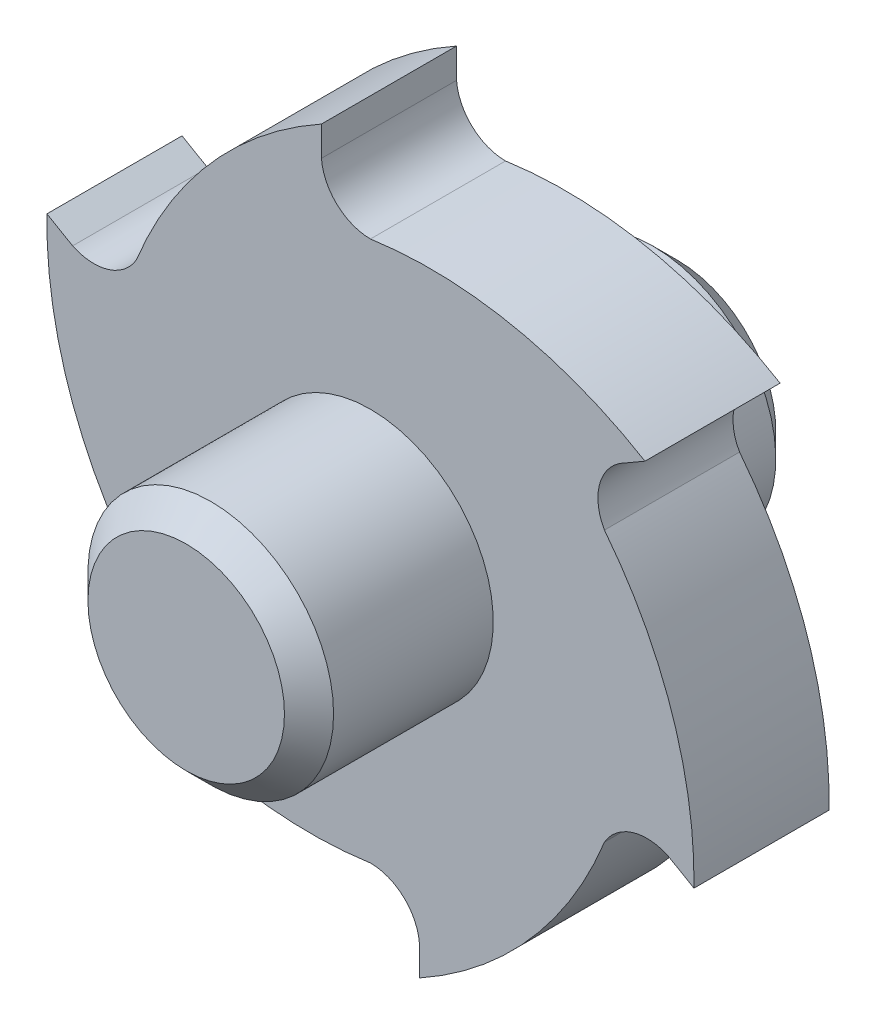
ISO-10303-21;
HEADER;
FILE_DESCRIPTION(('STEP AP214'),'2;1');
FILE_NAME('part.step','',(''),(''),'','','');
FILE_SCHEMA(('AUTOMOTIVE_DESIGN { 1 0 10303 214 1 1 1 1 }'));
ENDSEC;
DATA;
#1=APPLICATION_CONTEXT('core data for automotive mechanical design processes');
#2=APPLICATION_PROTOCOL_DEFINITION('international standard','automotive_design',2000,#1);
#3=PRODUCT_CONTEXT('',#1,'mechanical');
#4=PRODUCT('Part','Part','',(#3));
#5=PRODUCT_RELATED_PRODUCT_CATEGORY('part','',(#4));
#6=PRODUCT_DEFINITION_FORMATION('','',#4);
#7=PRODUCT_DEFINITION_CONTEXT('part definition',#1,'design');
#8=PRODUCT_DEFINITION('design','',#6,#7);
#9=PRODUCT_DEFINITION_SHAPE('','',#8);
#10=(LENGTH_UNIT() NAMED_UNIT(*) SI_UNIT(.MILLI.,.METRE.));
#11=(NAMED_UNIT(*) PLANE_ANGLE_UNIT() SI_UNIT($,.RADIAN.));
#12=(NAMED_UNIT(*) SI_UNIT($,.STERADIAN.) SOLID_ANGLE_UNIT());
#13=UNCERTAINTY_MEASURE_WITH_UNIT(LENGTH_MEASURE(1.E-05),#10,'distance_accuracy_value','');
#14=(GEOMETRIC_REPRESENTATION_CONTEXT(3) GLOBAL_UNCERTAINTY_ASSIGNED_CONTEXT((#13)) GLOBAL_UNIT_ASSIGNED_CONTEXT((#10,
#11,#12)) REPRESENTATION_CONTEXT('',''));
#15=CARTESIAN_POINT('',(0.,0.,0.));
#16=DIRECTION('',(0.,0.,1.));
#17=DIRECTION('',(1.,0.,0.));
#18=AXIS2_PLACEMENT_3D('',#15,#16,#17);
#19=CARTESIAN_POINT('',(0.,-10.,0.));
#20=DIRECTION('',(0.,0.,1.));
#21=DIRECTION('',(0.,-1.,0.));
#22=AXIS2_PLACEMENT_3D('',#19,#20,#21);
#23=PLANE('',#22);
#24=CARTESIAN_POINT('',(0.,-10.,0.));
#25=DIRECTION('',(0.,0.,1.));
#26=DIRECTION('',(0.,-1.,0.));
#27=AXIS2_PLACEMENT_3D('',#24,#25,#26);
#28=CIRCLE('',#27,8.00000000000002);
#29=CARTESIAN_POINT('',(0.,-18.,0.));
#30=VERTEX_POINT('',#29);
#31=EDGE_CURVE('E285',#30,#30,#28,.T.);
#32=ORIENTED_EDGE('',*,*,#31,.T.);
#33=EDGE_LOOP('',(#32));
#34=FACE_BOUND('',#33,.T.);
#35=ADVANCED_FACE('F33',(#34),#23,.T.);
#36=CARTESIAN_POINT('',(0.,-10.,-40.));
#37=DIRECTION('',(0.,0.,-1.));
#38=DIRECTION('',(0.,1.,0.));
#39=AXIS2_PLACEMENT_3D('',#36,#37,#38);
#40=CYLINDRICAL_SURFACE('',#39,10.);
#41=CARTESIAN_POINT('',(0.,-10.,-1.99999999999997));
#42=DIRECTION('',(0.,0.,1.));
#43=DIRECTION('',(1.,0.,0.));
#44=AXIS2_PLACEMENT_3D('',#41,#42,#43);
#45=CIRCLE('',#44,10.);
#46=CARTESIAN_POINT('',(10.,-10.,-1.99999999999997));
#47=VERTEX_POINT('',#46);
#48=EDGE_CURVE('E282',#47,#47,#45,.F.);
#49=ORIENTED_EDGE('',*,*,#48,.T.);
#50=EDGE_LOOP('',(#49));
#51=FACE_BOUND('',#50,.T.);
#52=CARTESIAN_POINT('',(0.,-10.,-15.));
#53=DIRECTION('',(0.,0.,-1.));
#54=DIRECTION('',(0.,1.,0.));
#55=AXIS2_PLACEMENT_3D('',#52,#53,#54);
#56=CIRCLE('',#55,10.);
#57=CARTESIAN_POINT('',(0.,0.,-15.));
#58=VERTEX_POINT('',#57);
#59=EDGE_CURVE('E274',#58,#58,#56,.T.);
#60=ORIENTED_EDGE('',*,*,#59,.F.);
#61=EDGE_LOOP('',(#60));
#62=FACE_BOUND('',#61,.T.);
#63=ADVANCED_FACE('F359',(#51,#62),#40,.T.);
#64=CARTESIAN_POINT('',(0.,0.,-15.));
#65=DIRECTION('',(0.,0.,1.));
#66=DIRECTION('',(0.,-1.,0.));
#67=AXIS2_PLACEMENT_3D('',#64,#65,#66);
#68=PLANE('',#67);
#69=DIRECTION('',(-0.86602540378444,-0.499999999999998,0.));
#70=VECTOR('',#69,1.);
#71=CARTESIAN_POINT('',(2.33605295787362,-4.04616241220868,-15.));
#72=LINE('',#71,#70);
#73=CARTESIAN_POINT('',(22.3517052133862,7.50987980551735,-15.));
#74=VERTEX_POINT('',#73);
#75=CARTESIAN_POINT('',(20.2561170823363,6.29999143394513,-15.));
#76=VERTEX_POINT('',#75);
#77=EDGE_CURVE('E230',#74,#76,#72,.T.);
#78=ORIENTED_EDGE('',*,*,#77,.F.);
#79=CARTESIAN_POINT('',(4.86710775958065,-21.6498330167719,-15.));
#80=DIRECTION('',(0.,0.,1.));
#81=DIRECTION('',(0.,-1.,0.));
#82=AXIS2_PLACEMENT_3D('',#79,#80,#81);
#83=CIRCLE('',#82,34.);
#84=CARTESIAN_POINT('',(0.,12.,-15.));
#85=VERTEX_POINT('',#84);
#86=EDGE_CURVE('E267',#85,#74,#83,.F.);
#87=ORIENTED_EDGE('',*,*,#86,.F.);
#88=CARTESIAN_POINT('',(0.,16.,-15.));
#89=DIRECTION('',(0.,0.,1.));
#90=DIRECTION('',(0.,-1.,0.));
#91=AXIS2_PLACEMENT_3D('',#88,#89,#90);
#92=CIRCLE('',#91,4.);
#93=CARTESIAN_POINT('',(-3.98814812209715,15.6923076923077,-15.));
#94=VERTEX_POINT('',#93);
#95=EDGE_CURVE('E265',#94,#85,#92,.T.);
#96=ORIENTED_EDGE('',*,*,#95,.F.);
#97=DIRECTION('',(0.,-1.,0.));
#98=VECTOR('',#97,1.);
#99=CARTESIAN_POINT('',(-3.98814812209715,0.,-15.));
#100=LINE('',#99,#98);
#101=CARTESIAN_POINT('',(-3.98814812209715,18.112084435452,-15.));
#102=VERTEX_POINT('',#101);
#103=EDGE_CURVE('E262',#102,#94,#100,.T.);
#104=ORIENTED_EDGE('',*,*,#103,.F.);
#105=CARTESIAN_POINT('',(12.5226052221614,-11.6098775456329,-15.));
#106=DIRECTION('',(0.,0.,1.));
#107=DIRECTION('',(0.,-1.,0.));
#108=AXIS2_PLACEMENT_3D('',#105,#106,#107);
#109=CIRCLE('',#108,34.);
#110=CARTESIAN_POINT('',(-19.0525588832575,1.00000000000022,-15.));
#111=VERTEX_POINT('',#110);
#112=EDGE_CURVE('E48',#111,#102,#109,.F.);
#113=ORIENTED_EDGE('',*,*,#112,.F.);
#114=CARTESIAN_POINT('',(-22.5166604983953,3.00000000000026,-15.));
#115=DIRECTION('',(0.,0.,1.));
#116=DIRECTION('',(0.,-1.,0.));
#117=AXIS2_PLACEMENT_3D('',#114,#115,#116);
#118=CIRCLE('',#117,4.);
#119=CARTESIAN_POINT('',(-24.2442652044333,-0.607683741637208,-15.));
#120=VERTEX_POINT('',#119);
#121=EDGE_CURVE('E173',#120,#111,#118,.T.);
#122=ORIENTED_EDGE('',*,*,#121,.F.);
#123=DIRECTION('',(0.866025403784433,-0.50000000000001,0.));
#124=VECTOR('',#123,1.);
#125=CARTESIAN_POINT('',(-6.32420107997087,-10.9538375877912,-15.));
#126=LINE('',#125,#124);
#127=CARTESIAN_POINT('',(-26.3398533354831,0.602204629935039,-15.));
#128=VERTEX_POINT('',#127);
#129=EDGE_CURVE('E232',#128,#120,#126,.T.);
#130=ORIENTED_EDGE('',*,*,#129,.F.);
#131=CARTESIAN_POINT('',(7.65549746258091,0.0399554711390695,-15.));
#132=DIRECTION('',(0.,0.,1.));
#133=DIRECTION('',(0.,-1.,0.));
#134=AXIS2_PLACEMENT_3D('',#131,#132,#133);
#135=CIRCLE('',#134,34.);
#136=CARTESIAN_POINT('',(-19.0525588832577,-20.9999999999998,-15.));
#137=VERTEX_POINT('',#136);
#138=EDGE_CURVE('E242',#137,#128,#135,.F.);
#139=ORIENTED_EDGE('',*,*,#138,.F.);
#140=CARTESIAN_POINT('',(-22.5166604983955,-22.9999999999998,-15.));
#141=DIRECTION('',(0.,0.,1.));
#142=DIRECTION('',(0.,-1.,0.));
#143=AXIS2_PLACEMENT_3D('',#140,#141,#142);
#144=CIRCLE('',#143,4.);
#145=CARTESIAN_POINT('',(-20.2561170823364,-26.299991433945,-15.));
#146=VERTEX_POINT('',#145);
#147=EDGE_CURVE('E240',#146,#137,#144,.T.);
#148=ORIENTED_EDGE('',*,*,#147,.F.);
#149=DIRECTION('',(0.866025403784443,0.499999999999992,0.));
#150=VECTOR('',#149,1.);
#151=CARTESIAN_POINT('',(6.32420107997069,-10.9538375877914,-15.));
#152=LINE('',#151,#150);
#153=CARTESIAN_POINT('',(-22.3517052133863,-27.5098798055172,-15.));
#154=VERTEX_POINT('',#153);
#155=EDGE_CURVE('E238',#154,#146,#152,.T.);
#156=ORIENTED_EDGE('',*,*,#155,.F.);
#157=CARTESIAN_POINT('',(-4.86710775958065,1.64983301677186,-15.));
#158=DIRECTION('',(0.,0.,1.));
#159=DIRECTION('',(0.,-1.,0.));
#160=AXIS2_PLACEMENT_3D('',#157,#158,#159);
#161=CIRCLE('',#160,34.);
#162=CARTESIAN_POINT('',(0.,-32.,-15.));
#163=VERTEX_POINT('',#162);
#164=EDGE_CURVE('E248',#163,#154,#161,.F.);
#165=ORIENTED_EDGE('',*,*,#164,.F.);
#166=CARTESIAN_POINT('',(0.,-36.,-15.));
#167=DIRECTION('',(0.,0.,1.));
#168=DIRECTION('',(0.,-1.,0.));
#169=AXIS2_PLACEMENT_3D('',#166,#167,#168);
#170=CIRCLE('',#169,4.);
#171=CARTESIAN_POINT('',(3.98814812209715,-35.6923076923077,-15.));
#172=VERTEX_POINT('',#171);
#173=EDGE_CURVE('E246',#172,#163,#170,.T.);
#174=ORIENTED_EDGE('',*,*,#173,.F.);
#175=DIRECTION('',(0.,1.,0.));
#176=VECTOR('',#175,1.);
#177=CARTESIAN_POINT('',(3.98814812209715,0.,-15.));
#178=LINE('',#177,#176);
#179=CARTESIAN_POINT('',(3.98814812209715,-38.1120844354521,-15.));
#180=VERTEX_POINT('',#179);
#181=EDGE_CURVE('E244',#180,#172,#178,.T.);
#182=ORIENTED_EDGE('',*,*,#181,.F.);
#183=CARTESIAN_POINT('',(-12.5226052221615,-8.39012245436722,-15.));
#184=DIRECTION('',(0.,0.,1.));
#185=DIRECTION('',(0.,-1.,0.));
#186=AXIS2_PLACEMENT_3D('',#183,#184,#185);
#187=CIRCLE('',#186,34.);
#188=CARTESIAN_POINT('',(19.0525588832576,-21.0000000000001,-15.));
#189=VERTEX_POINT('',#188);
#190=EDGE_CURVE('E254',#189,#180,#187,.F.);
#191=ORIENTED_EDGE('',*,*,#190,.F.);
#192=CARTESIAN_POINT('',(22.5166604983953,-23.0000000000001,-15.));
#193=DIRECTION('',(0.,0.,1.));
#194=DIRECTION('',(0.,-1.,0.));
#195=AXIS2_PLACEMENT_3D('',#192,#193,#194);
#196=CIRCLE('',#195,4.);
#197=CARTESIAN_POINT('',(24.2442652044333,-19.3923162583626,-15.));
#198=VERTEX_POINT('',#197);
#199=EDGE_CURVE('E252',#198,#189,#196,.T.);
#200=ORIENTED_EDGE('',*,*,#199,.F.);
#201=DIRECTION('',(-0.866025403784436,0.500000000000004,0.));
#202=VECTOR('',#201,1.);
#203=CARTESIAN_POINT('',(-2.33605295787363,-4.04616241220863,-15.));
#204=LINE('',#203,#202);
#205=CARTESIAN_POINT('',(26.3398533354832,-20.6022046299349,-15.));
#206=VERTEX_POINT('',#205);
#207=EDGE_CURVE('E250',#206,#198,#204,.T.);
#208=ORIENTED_EDGE('',*,*,#207,.F.);
#209=CARTESIAN_POINT('',(-7.65549746258084,-20.0399554711391,-15.));
#210=DIRECTION('',(0.,0.,1.));
#211=DIRECTION('',(0.,-1.,0.));
#212=AXIS2_PLACEMENT_3D('',#209,#210,#211);
#213=CIRCLE('',#212,34.);
#214=CARTESIAN_POINT('',(19.0525588832577,0.999999999999951,-15.));
#215=VERTEX_POINT('',#214);
#216=EDGE_CURVE('E257',#215,#206,#213,.F.);
#217=ORIENTED_EDGE('',*,*,#216,.F.);
#218=CARTESIAN_POINT('',(22.5166604983954,2.99999999999994,-15.));
#219=DIRECTION('',(0.,0.,1.));
#220=DIRECTION('',(0.,-1.,0.));
#221=AXIS2_PLACEMENT_3D('',#218,#219,#220);
#222=CIRCLE('',#221,4.);
#223=EDGE_CURVE('E221',#76,#215,#222,.T.);
#224=ORIENTED_EDGE('',*,*,#223,.F.);
#225=EDGE_LOOP('',(#78,#87,#96,#104,#113,#122,#130,#139,#148,#156,#165,#174,#182,#191,#200,#208,
#217,#224));
#226=FACE_BOUND('',#225,.T.);
#227=ORIENTED_EDGE('',*,*,#59,.T.);
#228=EDGE_LOOP('',(#227));
#229=FACE_BOUND('',#228,.T.);
#230=ADVANCED_FACE('F306',(#226,#229),#68,.T.);
#231=CARTESIAN_POINT('',(0.,20.,-26.));
#232=DIRECTION('',(0.,0.,-1.));
#233=DIRECTION('',(0.,1.,0.));
#234=AXIS2_PLACEMENT_3D('',#231,#232,#233);
#235=PLANE('',#234);
#236=DIRECTION('',(0.86602540378444,0.499999999999998,0.));
#237=VECTOR('',#236,1.);
#238=CARTESIAN_POINT('',(10.996306995718,0.953837587791273,-26.));
#239=LINE('',#238,#237);
#240=CARTESIAN_POINT('',(20.2561170823363,6.29999143394513,-26.));
#241=VERTEX_POINT('',#240);
#242=CARTESIAN_POINT('',(22.3517052133862,7.50987980551735,-26.));
#243=VERTEX_POINT('',#242);
#244=EDGE_CURVE('E225',#241,#243,#239,.T.);
#245=ORIENTED_EDGE('',*,*,#244,.F.);
#246=CARTESIAN_POINT('',(22.5166604983954,2.99999999999994,-26.));
#247=DIRECTION('',(0.,0.,-1.));
#248=DIRECTION('',(0.,1.,0.));
#249=AXIS2_PLACEMENT_3D('',#246,#247,#248);
#250=CIRCLE('',#249,4.);
#251=CARTESIAN_POINT('',(19.0525588832577,0.999999999999952,-26.));
#252=VERTEX_POINT('',#251);
#253=EDGE_CURVE('E11',#252,#241,#250,.T.);
#254=ORIENTED_EDGE('',*,*,#253,.F.);
#255=CARTESIAN_POINT('',(-7.65549746258084,-20.0399554711391,-26.));
#256=DIRECTION('',(0.,0.,-1.));
#257=DIRECTION('',(0.,1.,0.));
#258=AXIS2_PLACEMENT_3D('',#255,#256,#257);
#259=CIRCLE('',#258,34.);
#260=CARTESIAN_POINT('',(26.3398533354832,-20.6022046299349,-26.));
#261=VERTEX_POINT('',#260);
#262=EDGE_CURVE('E41',#261,#252,#259,.F.);
#263=ORIENTED_EDGE('',*,*,#262,.F.);
#264=DIRECTION('',(0.866025403784436,-0.500000000000004,0.));
#265=VECTOR('',#264,1.);
#266=CARTESIAN_POINT('',(-10.9963069957181,0.953837587791453,-26.));
#267=LINE('',#266,#265);
#268=CARTESIAN_POINT('',(24.2442652044333,-19.3923162583626,-26.));
#269=VERTEX_POINT('',#268);
#270=EDGE_CURVE('E204',#269,#261,#267,.T.);
#271=ORIENTED_EDGE('',*,*,#270,.F.);
#272=CARTESIAN_POINT('',(22.5166604983953,-23.0000000000001,-26.));
#273=DIRECTION('',(0.,0.,-1.));
#274=DIRECTION('',(0.,1.,0.));
#275=AXIS2_PLACEMENT_3D('',#272,#273,#274);
#276=CIRCLE('',#275,4.);
#277=CARTESIAN_POINT('',(19.0525588832576,-21.0000000000001,-26.));
#278=VERTEX_POINT('',#277);
#279=EDGE_CURVE('E202',#278,#269,#276,.T.);
#280=ORIENTED_EDGE('',*,*,#279,.F.);
#281=CARTESIAN_POINT('',(-12.5226052221615,-8.39012245436722,-26.));
#282=DIRECTION('',(0.,0.,-1.));
#283=DIRECTION('',(0.,1.,0.));
#284=AXIS2_PLACEMENT_3D('',#281,#282,#283);
#285=CIRCLE('',#284,34.);
#286=CARTESIAN_POINT('',(3.98814812209715,-38.1120844354521,-26.));
#287=VERTEX_POINT('',#286);
#288=EDGE_CURVE('E200',#287,#278,#285,.F.);
#289=ORIENTED_EDGE('',*,*,#288,.F.);
#290=DIRECTION('',(0.,-1.,0.));
#291=VECTOR('',#290,1.);
#292=CARTESIAN_POINT('',(3.98814812209716,20.,-26.));
#293=LINE('',#292,#291);
#294=CARTESIAN_POINT('',(3.98814812209715,-35.6923076923077,-26.));
#295=VERTEX_POINT('',#294);
#296=EDGE_CURVE('E198',#295,#287,#293,.T.);
#297=ORIENTED_EDGE('',*,*,#296,.F.);
#298=CARTESIAN_POINT('',(0.,-36.,-26.));
#299=DIRECTION('',(0.,0.,-1.));
#300=DIRECTION('',(0.,1.,0.));
#301=AXIS2_PLACEMENT_3D('',#298,#299,#300);
#302=CIRCLE('',#301,4.);
#303=CARTESIAN_POINT('',(0.,-32.,-26.));
#304=VERTEX_POINT('',#303);
#305=EDGE_CURVE('E196',#304,#295,#302,.T.);
#306=ORIENTED_EDGE('',*,*,#305,.F.);
#307=CARTESIAN_POINT('',(-4.86710775958065,1.64983301677186,-26.));
#308=DIRECTION('',(0.,0.,-1.));
#309=DIRECTION('',(0.,1.,0.));
#310=AXIS2_PLACEMENT_3D('',#307,#308,#309);
#311=CIRCLE('',#310,34.);
#312=CARTESIAN_POINT('',(-22.3517052133863,-27.5098798055172,-26.));
#313=VERTEX_POINT('',#312);
#314=EDGE_CURVE('E194',#313,#304,#311,.F.);
#315=ORIENTED_EDGE('',*,*,#314,.F.);
#316=DIRECTION('',(-0.866025403784443,-0.499999999999992,0.));
#317=VECTOR('',#316,1.);
#318=CARTESIAN_POINT('',(14.984455117815,-5.9538375877916,-26.));
#319=LINE('',#318,#317);
#320=CARTESIAN_POINT('',(-20.2561170823364,-26.299991433945,-26.));
#321=VERTEX_POINT('',#320);
#322=EDGE_CURVE('E192',#321,#313,#319,.T.);
#323=ORIENTED_EDGE('',*,*,#322,.F.);
#324=CARTESIAN_POINT('',(-22.5166604983955,-22.9999999999998,-26.));
#325=DIRECTION('',(0.,0.,-1.));
#326=DIRECTION('',(0.,1.,0.));
#327=AXIS2_PLACEMENT_3D('',#324,#325,#326);
#328=CIRCLE('',#327,4.);
#329=CARTESIAN_POINT('',(-19.0525588832577,-20.9999999999998,-26.));
#330=VERTEX_POINT('',#329);
#331=EDGE_CURVE('E185',#330,#321,#328,.T.);
#332=ORIENTED_EDGE('',*,*,#331,.F.);
#333=CARTESIAN_POINT('',(7.65549746258091,0.0399554711390717,-26.));
#334=DIRECTION('',(0.,0.,-1.));
#335=DIRECTION('',(0.,1.,0.));
#336=AXIS2_PLACEMENT_3D('',#333,#334,#335);
#337=CIRCLE('',#336,34.);
#338=CARTESIAN_POINT('',(-26.3398533354831,0.602204629935041,-26.));
#339=VERTEX_POINT('',#338);
#340=EDGE_CURVE('E183',#339,#330,#337,.F.);
#341=ORIENTED_EDGE('',*,*,#340,.F.);
#342=DIRECTION('',(-0.866025403784433,0.50000000000001,0.));
#343=VECTOR('',#342,1.);
#344=CARTESIAN_POINT('',(-14.9844551178154,-5.95383758779101,-26.));
#345=LINE('',#344,#343);
#346=CARTESIAN_POINT('',(-24.2442652044333,-0.607683741637208,-26.));
#347=VERTEX_POINT('',#346);
#348=EDGE_CURVE('E182',#347,#339,#345,.T.);
#349=ORIENTED_EDGE('',*,*,#348,.F.);
#350=CARTESIAN_POINT('',(-22.5166604983953,3.00000000000026,-26.));
#351=DIRECTION('',(0.,0.,-1.));
#352=DIRECTION('',(0.,1.,0.));
#353=AXIS2_PLACEMENT_3D('',#350,#351,#352);
#354=CIRCLE('',#353,4.);
#355=CARTESIAN_POINT('',(-19.0525588832575,1.00000000000022,-26.));
#356=VERTEX_POINT('',#355);
#357=EDGE_CURVE('E170',#356,#347,#354,.T.);
#358=ORIENTED_EDGE('',*,*,#357,.F.);
#359=CARTESIAN_POINT('',(12.5226052221614,-11.6098775456329,-26.));
#360=DIRECTION('',(0.,0.,-1.));
#361=DIRECTION('',(0.,1.,0.));
#362=AXIS2_PLACEMENT_3D('',#359,#360,#361);
#363=CIRCLE('',#362,34.);
#364=CARTESIAN_POINT('',(-3.98814812209715,18.112084435452,-26.));
#365=VERTEX_POINT('',#364);
#366=EDGE_CURVE('E157',#365,#356,#363,.F.);
#367=ORIENTED_EDGE('',*,*,#366,.F.);
#368=DIRECTION('',(0.,1.,0.));
#369=VECTOR('',#368,1.);
#370=CARTESIAN_POINT('',(-3.98814812209714,20.,-26.));
#371=LINE('',#370,#369);
#372=CARTESIAN_POINT('',(-3.98814812209715,15.6923076923077,-26.));
#373=VERTEX_POINT('',#372);
#374=EDGE_CURVE('E294',#373,#365,#371,.T.);
#375=ORIENTED_EDGE('',*,*,#374,.F.);
#376=CARTESIAN_POINT('',(0.,16.,-26.));
#377=DIRECTION('',(0.,0.,-1.));
#378=DIRECTION('',(0.,1.,0.));
#379=AXIS2_PLACEMENT_3D('',#376,#377,#378);
#380=CIRCLE('',#379,4.);
#381=CARTESIAN_POINT('',(0.,12.,-26.));
#382=VERTEX_POINT('',#381);
#383=EDGE_CURVE('E296',#382,#373,#380,.T.);
#384=ORIENTED_EDGE('',*,*,#383,.F.);
#385=CARTESIAN_POINT('',(4.86710775958065,-21.6498330167719,-26.));
#386=DIRECTION('',(0.,0.,-1.));
#387=DIRECTION('',(0.,1.,0.));
#388=AXIS2_PLACEMENT_3D('',#385,#386,#387);
#389=CIRCLE('',#388,34.);
#390=EDGE_CURVE('E227',#243,#382,#389,.F.);
#391=ORIENTED_EDGE('',*,*,#390,.F.);
#392=EDGE_LOOP('',(#245,#254,#263,#271,#280,#289,#297,#306,#315,#323,#332,#341,#349,#358,#367,
#375,#384,#391));
#393=FACE_BOUND('',#392,.T.);
#394=CARTESIAN_POINT('',(0.,-10.,-26.));
#395=DIRECTION('',(0.,0.,-1.));
#396=DIRECTION('',(0.,1.,0.));
#397=AXIS2_PLACEMENT_3D('',#394,#395,#396);
#398=CIRCLE('',#397,13.5);
#399=CARTESIAN_POINT('',(0.,3.5,-26.));
#400=VERTEX_POINT('',#399);
#401=EDGE_CURVE('E270',#400,#400,#398,.T.);
#402=ORIENTED_EDGE('',*,*,#401,.F.);
#403=EDGE_LOOP('',(#402));
#404=FACE_BOUND('',#403,.T.);
#405=ADVANCED_FACE('F179',(#393,#404),#235,.T.);
#406=CARTESIAN_POINT('',(0.,-10.,-27.));
#407=DIRECTION('',(0.,0.,1.));
#408=DIRECTION('',(0.,-1.,0.));
#409=AXIS2_PLACEMENT_3D('',#406,#407,#408);
#410=CYLINDRICAL_SURFACE('',#409,13.5);
#411=CARTESIAN_POINT('',(0.,-10.,-27.));
#412=DIRECTION('',(0.,0.,-1.));
#413=DIRECTION('',(0.,1.,0.));
#414=AXIS2_PLACEMENT_3D('',#411,#412,#413);
#415=CIRCLE('',#414,13.5);
#416=CARTESIAN_POINT('',(0.,3.5,-27.));
#417=VERTEX_POINT('',#416);
#418=EDGE_CURVE('E271',#417,#417,#415,.T.);
#419=ORIENTED_EDGE('',*,*,#418,.F.);
#420=EDGE_LOOP('',(#419));
#421=FACE_BOUND('',#420,.T.);
#422=ORIENTED_EDGE('',*,*,#401,.T.);
#423=EDGE_LOOP('',(#422));
#424=FACE_BOUND('',#423,.T.);
#425=ADVANCED_FACE('F389',(#421,#424),#410,.T.);
#426=CARTESIAN_POINT('',(0.,-10.,-27.));
#427=DIRECTION('',(0.,0.,-1.));
#428=DIRECTION('',(0.,1.,0.));
#429=AXIS2_PLACEMENT_3D('',#426,#427,#428);
#430=PLANE('',#429);
#431=CARTESIAN_POINT('',(0.,-10.,-27.));
#432=DIRECTION('',(0.,0.,-1.));
#433=DIRECTION('',(0.,1.,0.));
#434=AXIS2_PLACEMENT_3D('',#431,#432,#433);
#435=CIRCLE('',#434,10.);
#436=CARTESIAN_POINT('',(0.,0.,-27.));
#437=VERTEX_POINT('',#436);
#438=EDGE_CURVE('E279',#437,#437,#435,.F.);
#439=ORIENTED_EDGE('',*,*,#438,.T.);
#440=EDGE_LOOP('',(#439));
#441=FACE_BOUND('',#440,.T.);
#442=ORIENTED_EDGE('',*,*,#418,.T.);
#443=EDGE_LOOP('',(#442));
#444=FACE_BOUND('',#443,.T.);
#445=ADVANCED_FACE('F394',(#441,#444),#430,.T.);
#446=CARTESIAN_POINT('',(0.,0.,-40.));
#447=DIRECTION('',(0.,0.,-1.));
#448=DIRECTION('',(0.,1.,0.));
#449=AXIS2_PLACEMENT_3D('',#446,#447,#448);
#450=PLANE('',#449);
#451=CARTESIAN_POINT('',(0.,-10.,-40.));
#452=DIRECTION('',(0.,0.,-1.));
#453=DIRECTION('',(0.,1.,0.));
#454=AXIS2_PLACEMENT_3D('',#451,#452,#453);
#455=CIRCLE('',#454,8.00000000000001);
#456=CARTESIAN_POINT('',(0.,-1.99999999999999,-40.));
#457=VERTEX_POINT('',#456);
#458=EDGE_CURVE('E288',#457,#457,#455,.T.);
#459=ORIENTED_EDGE('',*,*,#458,.T.);
#460=EDGE_LOOP('',(#459));
#461=FACE_BOUND('',#460,.T.);
#462=ADVANCED_FACE('F377',(#461),#450,.T.);
#463=CARTESIAN_POINT('',(0.,-10.,-40.));
#464=DIRECTION('',(0.,0.,-1.));
#465=DIRECTION('',(0.,1.,0.));
#466=AXIS2_PLACEMENT_3D('',#463,#464,#465);
#467=CYLINDRICAL_SURFACE('',#466,10.);
#468=CARTESIAN_POINT('',(0.,-10.,-38.));
#469=DIRECTION('',(0.,0.,-1.));
#470=DIRECTION('',(-1.,0.,0.));
#471=AXIS2_PLACEMENT_3D('',#468,#469,#470);
#472=CIRCLE('',#471,10.);
#473=CARTESIAN_POINT('',(-10.,-10.,-38.));
#474=VERTEX_POINT('',#473);
#475=EDGE_CURVE('E291',#474,#474,#472,.F.);
#476=ORIENTED_EDGE('',*,*,#475,.T.);
#477=EDGE_LOOP('',(#476));
#478=FACE_BOUND('',#477,.T.);
#479=ORIENTED_EDGE('',*,*,#438,.F.);
#480=EDGE_LOOP('',(#479));
#481=FACE_BOUND('',#480,.T.);
#482=ADVANCED_FACE('F370',(#478,#481),#467,.T.);
#483=CARTESIAN_POINT('',(0.,-10.,-1.99999999999997));
#484=DIRECTION('',(0.,0.,-1.));
#485=DIRECTION('',(-1.,0.,0.));
#486=AXIS2_PLACEMENT_3D('',#483,#484,#485);
#487=CONICAL_SURFACE('',#486,10.,0.785398163397452);
#488=ORIENTED_EDGE('',*,*,#31,.F.);
#489=EDGE_LOOP('',(#488));
#490=FACE_BOUND('',#489,.T.);
#491=ORIENTED_EDGE('',*,*,#48,.F.);
#492=EDGE_LOOP('',(#491));
#493=FACE_BOUND('',#492,.T.);
#494=ADVANCED_FACE('F368',(#490,#493),#487,.T.);
#495=CARTESIAN_POINT('',(0.,-10.,-40.));
#496=DIRECTION('',(0.,0.,1.));
#497=DIRECTION('',(1.,0.,0.));
#498=AXIS2_PLACEMENT_3D('',#495,#496,#497);
#499=CONICAL_SURFACE('',#498,8.00000000000001,0.785398163397447);
#500=ORIENTED_EDGE('',*,*,#475,.F.);
#501=EDGE_LOOP('',(#500));
#502=FACE_BOUND('',#501,.T.);
#503=ORIENTED_EDGE('',*,*,#458,.F.);
#504=EDGE_LOOP('',(#503));
#505=FACE_BOUND('',#504,.T.);
#506=ADVANCED_FACE('F35',(#502,#505),#499,.T.);
#507=CARTESIAN_POINT('',(4.86710775958065,-21.6498330167719,-40.));
#508=DIRECTION('',(0.,0.,1.));
#509=DIRECTION('',(1.,0.,0.));
#510=AXIS2_PLACEMENT_3D('',#507,#508,#509);
#511=CYLINDRICAL_SURFACE('',#510,34.);
#512=ORIENTED_EDGE('',*,*,#86,.T.);
#513=DIRECTION('',(0.,0.,1.));
#514=VECTOR('',#513,1.);
#515=CARTESIAN_POINT('',(22.3517052133862,7.50987980551735,-40.));
#516=LINE('',#515,#514);
#517=EDGE_CURVE('E187',#74,#243,#516,.F.);
#518=ORIENTED_EDGE('',*,*,#517,.T.);
#519=ORIENTED_EDGE('',*,*,#390,.T.);
#520=DIRECTION('',(0.,0.,1.));
#521=VECTOR('',#520,1.);
#522=CARTESIAN_POINT('',(0.,12.,-40.));
#523=LINE('',#522,#521);
#524=EDGE_CURVE('E259',#382,#85,#523,.T.);
#525=ORIENTED_EDGE('',*,*,#524,.T.);
#526=EDGE_LOOP('',(#512,#518,#519,#525));
#527=FACE_BOUND('',#526,.T.);
#528=ADVANCED_FACE('F300',(#527),#511,.T.);
#529=CARTESIAN_POINT('',(0.,16.,-40.));
#530=DIRECTION('',(0.,0.,1.));
#531=DIRECTION('',(1.,0.,0.));
#532=AXIS2_PLACEMENT_3D('',#529,#530,#531);
#533=CYLINDRICAL_SURFACE('',#532,4.);
#534=ORIENTED_EDGE('',*,*,#95,.T.);
#535=ORIENTED_EDGE('',*,*,#524,.F.);
#536=ORIENTED_EDGE('',*,*,#383,.T.);
#537=DIRECTION('',(0.,0.,1.));
#538=VECTOR('',#537,1.);
#539=CARTESIAN_POINT('',(-3.98814812209715,15.6923076923077,-40.));
#540=LINE('',#539,#538);
#541=EDGE_CURVE('E56',#373,#94,#540,.T.);
#542=ORIENTED_EDGE('',*,*,#541,.T.);
#543=EDGE_LOOP('',(#534,#535,#536,#542));
#544=FACE_BOUND('',#543,.T.);
#545=ADVANCED_FACE('F349',(#544),#533,.F.);
#546=CARTESIAN_POINT('',(-3.98814812209715,15.6923076923077,-40.));
#547=DIRECTION('',(-1.,0.,0.));
#548=DIRECTION('',(0.,-1.,0.));
#549=AXIS2_PLACEMENT_3D('',#546,#547,#548);
#550=PLANE('',#549);
#551=ORIENTED_EDGE('',*,*,#374,.T.);
#552=DIRECTION('',(0.,0.,1.));
#553=VECTOR('',#552,1.);
#554=CARTESIAN_POINT('',(-3.98814812209715,18.112084435452,-40.));
#555=LINE('',#554,#553);
#556=EDGE_CURVE('E161',#365,#102,#555,.T.);
#557=ORIENTED_EDGE('',*,*,#556,.T.);
#558=ORIENTED_EDGE('',*,*,#103,.T.);
#559=ORIENTED_EDGE('',*,*,#541,.F.);
#560=EDGE_LOOP('',(#551,#557,#558,#559));
#561=FACE_BOUND('',#560,.T.);
#562=ADVANCED_FACE('F347',(#561),#550,.F.);
#563=CARTESIAN_POINT('',(-7.65549746258084,-20.0399554711391,-40.));
#564=DIRECTION('',(0.,0.,1.));
#565=DIRECTION('',(1.,0.,0.));
#566=AXIS2_PLACEMENT_3D('',#563,#564,#565);
#567=CYLINDRICAL_SURFACE('',#566,34.);
#568=ORIENTED_EDGE('',*,*,#216,.T.);
#569=DIRECTION('',(0.,0.,1.));
#570=VECTOR('',#569,1.);
#571=CARTESIAN_POINT('',(26.3398533354832,-20.6022046299349,-40.));
#572=LINE('',#571,#570);
#573=EDGE_CURVE('E213',#206,#261,#572,.F.);
#574=ORIENTED_EDGE('',*,*,#573,.T.);
#575=ORIENTED_EDGE('',*,*,#262,.T.);
#576=DIRECTION('',(0.,0.,1.));
#577=VECTOR('',#576,1.);
#578=CARTESIAN_POINT('',(19.0525588832577,0.999999999999953,-40.));
#579=LINE('',#578,#577);
#580=EDGE_CURVE('E165',#252,#215,#579,.T.);
#581=ORIENTED_EDGE('',*,*,#580,.T.);
#582=EDGE_LOOP('',(#568,#574,#575,#581));
#583=FACE_BOUND('',#582,.T.);
#584=ADVANCED_FACE('F210',(#583),#567,.T.);
#585=CARTESIAN_POINT('',(22.5166604983954,2.99999999999995,-40.));
#586=DIRECTION('',(0.,0.,1.));
#587=DIRECTION('',(1.,0.,0.));
#588=AXIS2_PLACEMENT_3D('',#585,#586,#587);
#589=CYLINDRICAL_SURFACE('',#588,4.);
#590=ORIENTED_EDGE('',*,*,#223,.T.);
#591=ORIENTED_EDGE('',*,*,#580,.F.);
#592=ORIENTED_EDGE('',*,*,#253,.T.);
#593=DIRECTION('',(0.,0.,1.));
#594=VECTOR('',#593,1.);
#595=CARTESIAN_POINT('',(20.2561170823363,6.29999143394513,-40.));
#596=LINE('',#595,#594);
#597=EDGE_CURVE('E222',#241,#76,#596,.T.);
#598=ORIENTED_EDGE('',*,*,#597,.T.);
#599=EDGE_LOOP('',(#590,#591,#592,#598));
#600=FACE_BOUND('',#599,.T.);
#601=ADVANCED_FACE('F217',(#600),#589,.F.);
#602=CARTESIAN_POINT('',(20.2561170823363,6.29999143394513,-40.));
#603=DIRECTION('',(-0.499999999999998,0.86602540378444,0.));
#604=DIRECTION('',(-0.86602540378444,-0.499999999999998,0.));
#605=AXIS2_PLACEMENT_3D('',#602,#603,#604);
#606=PLANE('',#605);
#607=ORIENTED_EDGE('',*,*,#77,.T.);
#608=ORIENTED_EDGE('',*,*,#597,.F.);
#609=ORIENTED_EDGE('',*,*,#244,.T.);
#610=ORIENTED_EDGE('',*,*,#517,.F.);
#611=EDGE_LOOP('',(#607,#608,#609,#610));
#612=FACE_BOUND('',#611,.T.);
#613=ADVANCED_FACE('F304',(#612),#606,.F.);
#614=CARTESIAN_POINT('',(-12.5226052221615,-8.39012245436722,-40.));
#615=DIRECTION('',(0.,0.,1.));
#616=DIRECTION('',(0.,-1.,0.));
#617=AXIS2_PLACEMENT_3D('',#614,#615,#616);
#618=CYLINDRICAL_SURFACE('',#617,34.);
#619=ORIENTED_EDGE('',*,*,#190,.T.);
#620=DIRECTION('',(0.,0.,1.));
#621=VECTOR('',#620,1.);
#622=CARTESIAN_POINT('',(3.98814812209715,-38.1120844354521,-40.));
#623=LINE('',#622,#621);
#624=EDGE_CURVE('E324',#180,#287,#623,.F.);
#625=ORIENTED_EDGE('',*,*,#624,.T.);
#626=ORIENTED_EDGE('',*,*,#288,.T.);
#627=DIRECTION('',(0.,0.,1.));
#628=VECTOR('',#627,1.);
#629=CARTESIAN_POINT('',(19.0525588832576,-21.0000000000001,-40.));
#630=LINE('',#629,#628);
#631=EDGE_CURVE('E319',#278,#189,#630,.T.);
#632=ORIENTED_EDGE('',*,*,#631,.T.);
#633=EDGE_LOOP('',(#619,#625,#626,#632));
#634=FACE_BOUND('',#633,.T.);
#635=ADVANCED_FACE('F482',(#634),#618,.T.);
#636=CARTESIAN_POINT('',(22.5166604983953,-23.0000000000001,-40.));
#637=DIRECTION('',(0.,0.,1.));
#638=DIRECTION('',(0.,-1.,0.));
#639=AXIS2_PLACEMENT_3D('',#636,#637,#638);
#640=CYLINDRICAL_SURFACE('',#639,4.);
#641=ORIENTED_EDGE('',*,*,#199,.T.);
#642=ORIENTED_EDGE('',*,*,#631,.F.);
#643=ORIENTED_EDGE('',*,*,#279,.T.);
#644=DIRECTION('',(0.,0.,1.));
#645=VECTOR('',#644,1.);
#646=CARTESIAN_POINT('',(24.2442652044333,-19.3923162583626,-40.));
#647=LINE('',#646,#645);
#648=EDGE_CURVE('E322',#269,#198,#647,.T.);
#649=ORIENTED_EDGE('',*,*,#648,.T.);
#650=EDGE_LOOP('',(#641,#642,#643,#649));
#651=FACE_BOUND('',#650,.T.);
#652=ADVANCED_FACE('F491',(#651),#640,.F.);
#653=CARTESIAN_POINT('',(24.2442652044333,-19.3923162583626,-40.));
#654=DIRECTION('',(0.500000000000004,0.866025403784436,0.));
#655=DIRECTION('',(-0.866025403784436,0.500000000000004,0.));
#656=AXIS2_PLACEMENT_3D('',#653,#654,#655);
#657=PLANE('',#656);
#658=ORIENTED_EDGE('',*,*,#207,.T.);
#659=ORIENTED_EDGE('',*,*,#648,.F.);
#660=ORIENTED_EDGE('',*,*,#270,.T.);
#661=ORIENTED_EDGE('',*,*,#573,.F.);
#662=EDGE_LOOP('',(#658,#659,#660,#661));
#663=FACE_BOUND('',#662,.T.);
#664=ADVANCED_FACE('F312',(#663),#657,.F.);
#665=CARTESIAN_POINT('',(-4.86710775958065,1.64983301677187,-40.));
#666=DIRECTION('',(0.,0.,1.));
#667=DIRECTION('',(0.,-1.,0.));
#668=AXIS2_PLACEMENT_3D('',#665,#666,#667);
#669=CYLINDRICAL_SURFACE('',#668,34.);
#670=ORIENTED_EDGE('',*,*,#164,.T.);
#671=DIRECTION('',(0.,0.,1.));
#672=VECTOR('',#671,1.);
#673=CARTESIAN_POINT('',(-22.3517052133863,-27.5098798055172,-40.));
#674=LINE('',#673,#672);
#675=EDGE_CURVE('E315',#154,#313,#674,.F.);
#676=ORIENTED_EDGE('',*,*,#675,.T.);
#677=ORIENTED_EDGE('',*,*,#314,.T.);
#678=DIRECTION('',(0.,0.,1.));
#679=VECTOR('',#678,1.);
#680=CARTESIAN_POINT('',(0.,-32.,-40.));
#681=LINE('',#680,#679);
#682=EDGE_CURVE('E329',#304,#163,#681,.T.);
#683=ORIENTED_EDGE('',*,*,#682,.T.);
#684=EDGE_LOOP('',(#670,#676,#677,#683));
#685=FACE_BOUND('',#684,.T.);
#686=ADVANCED_FACE('F510',(#685),#669,.T.);
#687=CARTESIAN_POINT('',(0.,-36.,-40.));
#688=DIRECTION('',(0.,0.,1.));
#689=DIRECTION('',(0.,-1.,0.));
#690=AXIS2_PLACEMENT_3D('',#687,#688,#689);
#691=CYLINDRICAL_SURFACE('',#690,4.);
#692=ORIENTED_EDGE('',*,*,#173,.T.);
#693=ORIENTED_EDGE('',*,*,#682,.F.);
#694=ORIENTED_EDGE('',*,*,#305,.T.);
#695=DIRECTION('',(0.,0.,1.));
#696=VECTOR('',#695,1.);
#697=CARTESIAN_POINT('',(3.98814812209715,-35.6923076923077,-40.));
#698=LINE('',#697,#696);
#699=EDGE_CURVE('E330',#295,#172,#698,.T.);
#700=ORIENTED_EDGE('',*,*,#699,.T.);
#701=EDGE_LOOP('',(#692,#693,#694,#700));
#702=FACE_BOUND('',#701,.T.);
#703=ADVANCED_FACE('F519',(#702),#691,.F.);
#704=CARTESIAN_POINT('',(3.98814812209715,-35.6923076923077,-40.));
#705=DIRECTION('',(1.,0.,0.));
#706=DIRECTION('',(0.,1.,0.));
#707=AXIS2_PLACEMENT_3D('',#704,#705,#706);
#708=PLANE('',#707);
#709=ORIENTED_EDGE('',*,*,#181,.T.);
#710=ORIENTED_EDGE('',*,*,#699,.F.);
#711=ORIENTED_EDGE('',*,*,#296,.T.);
#712=ORIENTED_EDGE('',*,*,#624,.F.);
#713=EDGE_LOOP('',(#709,#710,#711,#712));
#714=FACE_BOUND('',#713,.T.);
#715=ADVANCED_FACE('F529',(#714),#708,.F.);
#716=CARTESIAN_POINT('',(7.65549746258091,0.0399554711390745,-40.));
#717=DIRECTION('',(0.,0.,1.));
#718=DIRECTION('',(0.,-1.,0.));
#719=AXIS2_PLACEMENT_3D('',#716,#717,#718);
#720=CYLINDRICAL_SURFACE('',#719,34.);
#721=ORIENTED_EDGE('',*,*,#138,.T.);
#722=DIRECTION('',(0.,0.,1.));
#723=VECTOR('',#722,1.);
#724=CARTESIAN_POINT('',(-26.3398533354831,0.602204629935044,-40.));
#725=LINE('',#724,#723);
#726=EDGE_CURVE('E174',#128,#339,#725,.F.);
#727=ORIENTED_EDGE('',*,*,#726,.T.);
#728=ORIENTED_EDGE('',*,*,#340,.T.);
#729=DIRECTION('',(0.,0.,1.));
#730=VECTOR('',#729,1.);
#731=CARTESIAN_POINT('',(-19.0525588832577,-20.9999999999998,-40.));
#732=LINE('',#731,#730);
#733=EDGE_CURVE('E333',#330,#137,#732,.T.);
#734=ORIENTED_EDGE('',*,*,#733,.T.);
#735=EDGE_LOOP('',(#721,#727,#728,#734));
#736=FACE_BOUND('',#735,.T.);
#737=ADVANCED_FACE('F539',(#736),#720,.T.);
#738=CARTESIAN_POINT('',(-22.5166604983955,-22.9999999999998,-40.));
#739=DIRECTION('',(0.,0.,1.));
#740=DIRECTION('',(0.,-1.,0.));
#741=AXIS2_PLACEMENT_3D('',#738,#739,#740);
#742=CYLINDRICAL_SURFACE('',#741,4.);
#743=ORIENTED_EDGE('',*,*,#147,.T.);
#744=ORIENTED_EDGE('',*,*,#733,.F.);
#745=ORIENTED_EDGE('',*,*,#331,.T.);
#746=DIRECTION('',(0.,0.,1.));
#747=VECTOR('',#746,1.);
#748=CARTESIAN_POINT('',(-20.2561170823364,-26.299991433945,-40.));
#749=LINE('',#748,#747);
#750=EDGE_CURVE('E336',#321,#146,#749,.T.);
#751=ORIENTED_EDGE('',*,*,#750,.T.);
#752=EDGE_LOOP('',(#743,#744,#745,#751));
#753=FACE_BOUND('',#752,.T.);
#754=ADVANCED_FACE('F549',(#753),#742,.F.);
#755=CARTESIAN_POINT('',(-20.2561170823364,-26.299991433945,-40.));
#756=DIRECTION('',(0.499999999999992,-0.866025403784443,0.));
#757=DIRECTION('',(0.866025403784443,0.499999999999992,0.));
#758=AXIS2_PLACEMENT_3D('',#755,#756,#757);
#759=PLANE('',#758);
#760=ORIENTED_EDGE('',*,*,#155,.T.);
#761=ORIENTED_EDGE('',*,*,#750,.F.);
#762=ORIENTED_EDGE('',*,*,#322,.T.);
#763=ORIENTED_EDGE('',*,*,#675,.F.);
#764=EDGE_LOOP('',(#760,#761,#762,#763));
#765=FACE_BOUND('',#764,.T.);
#766=ADVANCED_FACE('F559',(#765),#759,.F.);
#767=CARTESIAN_POINT('',(12.5226052221614,-11.6098775456329,-40.));
#768=DIRECTION('',(0.,0.,1.));
#769=DIRECTION('',(1.,0.,0.));
#770=AXIS2_PLACEMENT_3D('',#767,#768,#769);
#771=CYLINDRICAL_SURFACE('',#770,34.);
#772=ORIENTED_EDGE('',*,*,#112,.T.);
#773=ORIENTED_EDGE('',*,*,#556,.F.);
#774=ORIENTED_EDGE('',*,*,#366,.T.);
#775=DIRECTION('',(0.,0.,1.));
#776=VECTOR('',#775,1.);
#777=CARTESIAN_POINT('',(-19.0525588832575,1.00000000000022,-40.));
#778=LINE('',#777,#776);
#779=EDGE_CURVE('E160',#356,#111,#778,.T.);
#780=ORIENTED_EDGE('',*,*,#779,.T.);
#781=EDGE_LOOP('',(#772,#773,#774,#780));
#782=FACE_BOUND('',#781,.T.);
#783=ADVANCED_FACE('F159',(#782),#771,.T.);
#784=CARTESIAN_POINT('',(-22.5166604983953,3.00000000000026,-40.));
#785=DIRECTION('',(0.,0.,1.));
#786=DIRECTION('',(1.,0.,0.));
#787=AXIS2_PLACEMENT_3D('',#784,#785,#786);
#788=CYLINDRICAL_SURFACE('',#787,4.);
#789=ORIENTED_EDGE('',*,*,#121,.T.);
#790=ORIENTED_EDGE('',*,*,#779,.F.);
#791=ORIENTED_EDGE('',*,*,#357,.T.);
#792=DIRECTION('',(0.,0.,1.));
#793=VECTOR('',#792,1.);
#794=CARTESIAN_POINT('',(-24.2442652044333,-0.607683741637207,-40.));
#795=LINE('',#794,#793);
#796=EDGE_CURVE('E175',#347,#120,#795,.T.);
#797=ORIENTED_EDGE('',*,*,#796,.T.);
#798=EDGE_LOOP('',(#789,#790,#791,#797));
#799=FACE_BOUND('',#798,.T.);
#800=ADVANCED_FACE('F168',(#799),#788,.F.);
#801=CARTESIAN_POINT('',(-24.2442652044333,-0.607683741637207,-40.));
#802=DIRECTION('',(-0.50000000000001,-0.866025403784433,0.));
#803=DIRECTION('',(0.866025403784433,-0.50000000000001,0.));
#804=AXIS2_PLACEMENT_3D('',#801,#802,#803);
#805=PLANE('',#804);
#806=ORIENTED_EDGE('',*,*,#129,.T.);
#807=ORIENTED_EDGE('',*,*,#796,.F.);
#808=ORIENTED_EDGE('',*,*,#348,.T.);
#809=ORIENTED_EDGE('',*,*,#726,.F.);
#810=EDGE_LOOP('',(#806,#807,#808,#809));
#811=FACE_BOUND('',#810,.T.);
#812=ADVANCED_FACE('F586',(#811),#805,.F.);
#813=CLOSED_SHELL('',(#35,#63,#230,#405,#425,#445,#462,#482,#494,#506,#528,#545,#562,#584,#601,
#613,#635,#652,#664,#686,#703,#715,#737,#754,#766,#783,#800,#812));
#814=MANIFOLD_SOLID_BREP('B2',#813);
#815=ADVANCED_BREP_SHAPE_REPRESENTATION('',(#18,#814),#14);
#816=SHAPE_DEFINITION_REPRESENTATION(#9,#815);
ENDSEC;
END-ISO-10303-21;
